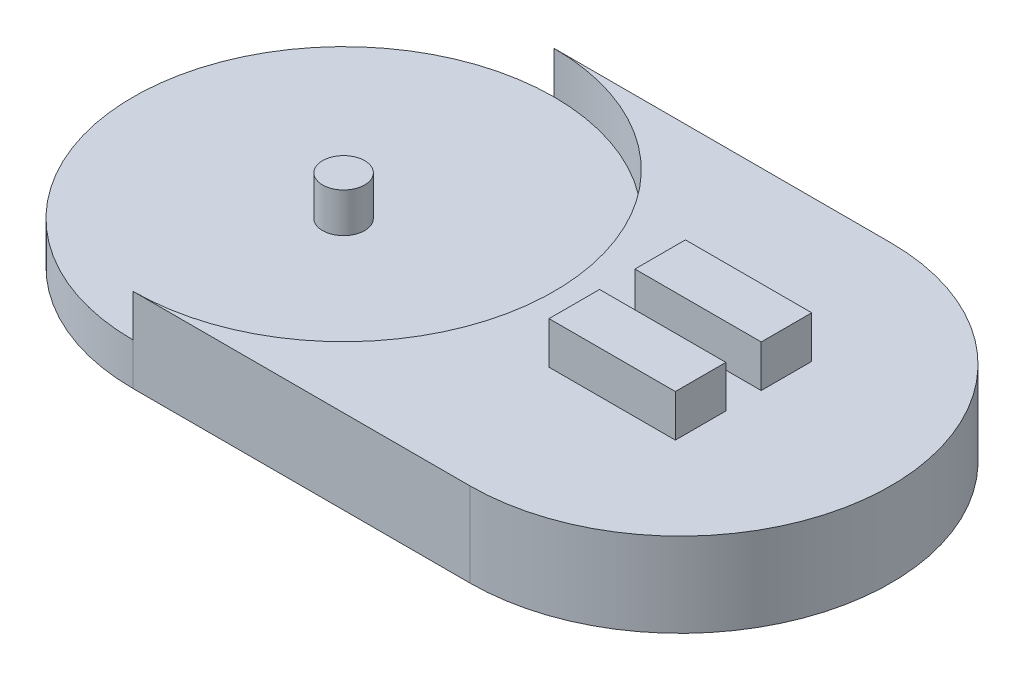
ISO-10303-21;
HEADER;
FILE_DESCRIPTION(('STEP AP214'),'2;1');
FILE_NAME('part.step','',(''),(''),'','','');
FILE_SCHEMA(('AUTOMOTIVE_DESIGN { 1 0 10303 214 1 1 1 1 }'));
ENDSEC;
DATA;
#1=APPLICATION_CONTEXT('core data for automotive mechanical design processes');
#2=APPLICATION_PROTOCOL_DEFINITION('international standard','automotive_design',2000,#1);
#3=PRODUCT_CONTEXT('',#1,'mechanical');
#4=PRODUCT('Part','Part','',(#3));
#5=PRODUCT_RELATED_PRODUCT_CATEGORY('part','',(#4));
#6=PRODUCT_DEFINITION_FORMATION('','',#4);
#7=PRODUCT_DEFINITION_CONTEXT('part definition',#1,'design');
#8=PRODUCT_DEFINITION('design','',#6,#7);
#9=PRODUCT_DEFINITION_SHAPE('','',#8);
#10=(LENGTH_UNIT() NAMED_UNIT(*) SI_UNIT(.MILLI.,.METRE.));
#11=(NAMED_UNIT(*) PLANE_ANGLE_UNIT() SI_UNIT($,.RADIAN.));
#12=(NAMED_UNIT(*) SI_UNIT($,.STERADIAN.) SOLID_ANGLE_UNIT());
#13=UNCERTAINTY_MEASURE_WITH_UNIT(LENGTH_MEASURE(1.E-05),#10,'distance_accuracy_value','');
#14=(GEOMETRIC_REPRESENTATION_CONTEXT(3) GLOBAL_UNCERTAINTY_ASSIGNED_CONTEXT((#13)) GLOBAL_UNIT_ASSIGNED_CONTEXT((#10,
#11,#12)) REPRESENTATION_CONTEXT('',''));
#15=CARTESIAN_POINT('',(0.,0.,0.));
#16=DIRECTION('',(0.,0.,1.));
#17=DIRECTION('',(1.,0.,0.));
#18=AXIS2_PLACEMENT_3D('',#15,#16,#17);
#19=CARTESIAN_POINT('',(0.,10.,0.));
#20=DIRECTION('',(0.,1.,0.));
#21=DIRECTION('',(0.,0.,1.));
#22=AXIS2_PLACEMENT_3D('',#19,#20,#21);
#23=PLANE('',#22);
#24=CARTESIAN_POINT('',(0.,10.,0.));
#25=DIRECTION('',(0.,1.,0.));
#26=DIRECTION('',(0.,0.,1.));
#27=AXIS2_PLACEMENT_3D('',#24,#25,#26);
#28=CIRCLE('',#27,25.);
#29=CARTESIAN_POINT('',(0.,10.,25.));
#30=VERTEX_POINT('',#29);
#31=CARTESIAN_POINT('',(0.,10.,-25.));
#32=VERTEX_POINT('',#31);
#33=EDGE_CURVE('E213',#30,#32,#28,.T.);
#34=ORIENTED_EDGE('',*,*,#33,.F.);
#35=DIRECTION('',(1.,0.,0.));
#36=VECTOR('',#35,1.);
#37=CARTESIAN_POINT('',(0.,10.,25.));
#38=LINE('',#37,#36);
#39=CARTESIAN_POINT('',(40.,10.,25.));
#40=VERTEX_POINT('',#39);
#41=EDGE_CURVE('E225',#30,#40,#38,.T.);
#42=ORIENTED_EDGE('',*,*,#41,.T.);
#43=CARTESIAN_POINT('',(40.,10.,0.));
#44=DIRECTION('',(0.,1.,0.));
#45=DIRECTION('',(0.,0.,1.));
#46=AXIS2_PLACEMENT_3D('',#43,#44,#45);
#47=CIRCLE('',#46,25.);
#48=CARTESIAN_POINT('',(40.,10.,-25.));
#49=VERTEX_POINT('',#48);
#50=EDGE_CURVE('E228',#40,#49,#47,.T.);
#51=ORIENTED_EDGE('',*,*,#50,.T.);
#52=DIRECTION('',(-1.,0.,0.));
#53=VECTOR('',#52,1.);
#54=CARTESIAN_POINT('',(0.,10.,-25.));
#55=LINE('',#54,#53);
#56=EDGE_CURVE('E232',#49,#32,#55,.T.);
#57=ORIENTED_EDGE('',*,*,#56,.T.);
#58=EDGE_LOOP('',(#34,#42,#51,#57));
#59=FACE_BOUND('',#58,.T.);
#60=DIRECTION('',(1.,0.,0.));
#61=VECTOR('',#60,1.);
#62=CARTESIAN_POINT('',(32.5,10.,-2.1));
#63=LINE('',#62,#61);
#64=CARTESIAN_POINT('',(32.5,10.,-2.1));
#65=VERTEX_POINT('',#64);
#66=CARTESIAN_POINT('',(47.5,10.,-2.10000000000001));
#67=VERTEX_POINT('',#66);
#68=EDGE_CURVE('E169',#65,#67,#63,.T.);
#69=ORIENTED_EDGE('',*,*,#68,.F.);
#70=DIRECTION('',(0.,0.,1.));
#71=VECTOR('',#70,1.);
#72=CARTESIAN_POINT('',(32.5,10.,-8.1));
#73=LINE('',#72,#71);
#74=CARTESIAN_POINT('',(32.5,10.,-8.1));
#75=VERTEX_POINT('',#74);
#76=EDGE_CURVE('E164',#75,#65,#73,.T.);
#77=ORIENTED_EDGE('',*,*,#76,.F.);
#78=DIRECTION('',(-1.,0.,0.));
#79=VECTOR('',#78,1.);
#80=CARTESIAN_POINT('',(32.5,10.,-8.1));
#81=LINE('',#80,#79);
#82=CARTESIAN_POINT('',(47.5,10.,-8.10000000000001));
#83=VERTEX_POINT('',#82);
#84=EDGE_CURVE('E179',#83,#75,#81,.T.);
#85=ORIENTED_EDGE('',*,*,#84,.F.);
#86=DIRECTION('',(0.,0.,-1.));
#87=VECTOR('',#86,1.);
#88=CARTESIAN_POINT('',(47.5,10.,-8.10000000000001));
#89=LINE('',#88,#87);
#90=EDGE_CURVE('E191',#67,#83,#89,.T.);
#91=ORIENTED_EDGE('',*,*,#90,.F.);
#92=EDGE_LOOP('',(#69,#77,#85,#91));
#93=FACE_BOUND('',#92,.T.);
#94=DIRECTION('',(1.,0.,0.));
#95=VECTOR('',#94,1.);
#96=CARTESIAN_POINT('',(32.5,10.,8.1));
#97=LINE('',#96,#95);
#98=CARTESIAN_POINT('',(32.5,10.,8.1));
#99=VERTEX_POINT('',#98);
#100=CARTESIAN_POINT('',(47.5,10.,8.1));
#101=VERTEX_POINT('',#100);
#102=EDGE_CURVE('E465',#99,#101,#97,.T.);
#103=ORIENTED_EDGE('',*,*,#102,.F.);
#104=DIRECTION('',(0.,0.,1.));
#105=VECTOR('',#104,1.);
#106=CARTESIAN_POINT('',(32.5,10.,2.1));
#107=LINE('',#106,#105);
#108=CARTESIAN_POINT('',(32.5,10.,2.1));
#109=VERTEX_POINT('',#108);
#110=EDGE_CURVE('E161',#109,#99,#107,.T.);
#111=ORIENTED_EDGE('',*,*,#110,.F.);
#112=DIRECTION('',(-1.,0.,0.));
#113=VECTOR('',#112,1.);
#114=CARTESIAN_POINT('',(32.5,10.,2.1));
#115=LINE('',#114,#113);
#116=CARTESIAN_POINT('',(47.5,10.,2.1));
#117=VERTEX_POINT('',#116);
#118=EDGE_CURVE('E157',#117,#109,#115,.T.);
#119=ORIENTED_EDGE('',*,*,#118,.F.);
#120=DIRECTION('',(0.,0.,-1.));
#121=VECTOR('',#120,1.);
#122=CARTESIAN_POINT('',(47.5,10.,2.1));
#123=LINE('',#122,#121);
#124=EDGE_CURVE('E461',#101,#117,#123,.T.);
#125=ORIENTED_EDGE('',*,*,#124,.F.);
#126=EDGE_LOOP('',(#103,#111,#119,#125));
#127=FACE_BOUND('',#126,.T.);
#128=ADVANCED_FACE('F39',(#59,#93,#127),#23,.T.);
#129=CARTESIAN_POINT('',(0.,10.,0.));
#130=DIRECTION('',(0.,-1.,0.));
#131=DIRECTION('',(0.,0.,-1.));
#132=AXIS2_PLACEMENT_3D('',#129,#130,#131);
#133=CYLINDRICAL_SURFACE('',#132,25.);
#134=CARTESIAN_POINT('',(0.,5.,0.));
#135=DIRECTION('',(0.,1.,0.));
#136=DIRECTION('',(0.,0.,1.));
#137=AXIS2_PLACEMENT_3D('',#134,#135,#136);
#138=CIRCLE('',#137,25.);
#139=CARTESIAN_POINT('',(0.,5.,-25.));
#140=VERTEX_POINT('',#139);
#141=CARTESIAN_POINT('',(0.,5.,25.));
#142=VERTEX_POINT('',#141);
#143=EDGE_CURVE('E222',#140,#142,#138,.T.);
#144=ORIENTED_EDGE('',*,*,#143,.F.);
#145=DIRECTION('',(0.,-1.,0.));
#146=VECTOR('',#145,1.);
#147=CARTESIAN_POINT('',(0.,10.,-25.));
#148=LINE('',#147,#146);
#149=CARTESIAN_POINT('',(0.,0.,-25.));
#150=VERTEX_POINT('',#149);
#151=EDGE_CURVE('E236',#140,#150,#148,.T.);
#152=ORIENTED_EDGE('',*,*,#151,.T.);
#153=CARTESIAN_POINT('',(0.,0.,0.));
#154=DIRECTION('',(0.,1.,0.));
#155=DIRECTION('',(0.,0.,1.));
#156=AXIS2_PLACEMENT_3D('',#153,#154,#155);
#157=CIRCLE('',#156,25.);
#158=CARTESIAN_POINT('',(0.,0.,25.));
#159=VERTEX_POINT('',#158);
#160=EDGE_CURVE('E221',#150,#159,#157,.T.);
#161=ORIENTED_EDGE('',*,*,#160,.T.);
#162=DIRECTION('',(0.,-1.,0.));
#163=VECTOR('',#162,1.);
#164=CARTESIAN_POINT('',(0.,10.,25.));
#165=LINE('',#164,#163);
#166=EDGE_CURVE('E48',#142,#159,#165,.T.);
#167=ORIENTED_EDGE('',*,*,#166,.F.);
#168=EDGE_LOOP('',(#144,#152,#161,#167));
#169=FACE_BOUND('',#168,.T.);
#170=ADVANCED_FACE('F41',(#169),#133,.T.);
#171=CARTESIAN_POINT('',(0.,10.,25.));
#172=DIRECTION('',(0.,0.,-1.));
#173=DIRECTION('',(-1.,0.,0.));
#174=AXIS2_PLACEMENT_3D('',#171,#172,#173);
#175=PLANE('',#174);
#176=DIRECTION('',(1.,0.,0.));
#177=VECTOR('',#176,1.);
#178=CARTESIAN_POINT('',(0.,0.,25.));
#179=LINE('',#178,#177);
#180=CARTESIAN_POINT('',(40.,0.,25.));
#181=VERTEX_POINT('',#180);
#182=EDGE_CURVE('E240',#159,#181,#179,.T.);
#183=ORIENTED_EDGE('',*,*,#182,.T.);
#184=DIRECTION('',(0.,-1.,0.));
#185=VECTOR('',#184,1.);
#186=CARTESIAN_POINT('',(40.,10.,25.));
#187=LINE('',#186,#185);
#188=EDGE_CURVE('E255',#40,#181,#187,.T.);
#189=ORIENTED_EDGE('',*,*,#188,.F.);
#190=ORIENTED_EDGE('',*,*,#41,.F.);
#191=EDGE_CURVE('E11',#30,#142,#165,.T.);
#192=ORIENTED_EDGE('',*,*,#191,.T.);
#193=ORIENTED_EDGE('',*,*,#166,.T.);
#194=EDGE_LOOP('',(#183,#189,#190,#192,#193));
#195=FACE_BOUND('',#194,.T.);
#196=ADVANCED_FACE('F266',(#195),#175,.F.);
#197=CARTESIAN_POINT('',(40.,10.,0.));
#198=DIRECTION('',(0.,-1.,0.));
#199=DIRECTION('',(0.,0.,-1.));
#200=AXIS2_PLACEMENT_3D('',#197,#198,#199);
#201=CYLINDRICAL_SURFACE('',#200,25.);
#202=CARTESIAN_POINT('',(40.,0.,0.));
#203=DIRECTION('',(0.,1.,0.));
#204=DIRECTION('',(0.,0.,1.));
#205=AXIS2_PLACEMENT_3D('',#202,#203,#204);
#206=CIRCLE('',#205,25.);
#207=CARTESIAN_POINT('',(40.,0.,-25.));
#208=VERTEX_POINT('',#207);
#209=EDGE_CURVE('E243',#181,#208,#206,.T.);
#210=ORIENTED_EDGE('',*,*,#209,.T.);
#211=DIRECTION('',(0.,-1.,0.));
#212=VECTOR('',#211,1.);
#213=CARTESIAN_POINT('',(40.,10.,-25.));
#214=LINE('',#213,#212);
#215=EDGE_CURVE('E252',#49,#208,#214,.T.);
#216=ORIENTED_EDGE('',*,*,#215,.F.);
#217=ORIENTED_EDGE('',*,*,#50,.F.);
#218=ORIENTED_EDGE('',*,*,#188,.T.);
#219=EDGE_LOOP('',(#210,#216,#217,#218));
#220=FACE_BOUND('',#219,.T.);
#221=ADVANCED_FACE('F281',(#220),#201,.T.);
#222=CARTESIAN_POINT('',(0.,10.,-25.));
#223=DIRECTION('',(0.,0.,1.));
#224=DIRECTION('',(1.,0.,0.));
#225=AXIS2_PLACEMENT_3D('',#222,#223,#224);
#226=PLANE('',#225);
#227=DIRECTION('',(-1.,0.,0.));
#228=VECTOR('',#227,1.);
#229=CARTESIAN_POINT('',(0.,0.,-25.));
#230=LINE('',#229,#228);
#231=EDGE_CURVE('E229',#208,#150,#230,.T.);
#232=ORIENTED_EDGE('',*,*,#231,.T.);
#233=ORIENTED_EDGE('',*,*,#151,.F.);
#234=EDGE_CURVE('E249',#32,#140,#148,.T.);
#235=ORIENTED_EDGE('',*,*,#234,.F.);
#236=ORIENTED_EDGE('',*,*,#56,.F.);
#237=ORIENTED_EDGE('',*,*,#215,.T.);
#238=EDGE_LOOP('',(#232,#233,#235,#236,#237));
#239=FACE_BOUND('',#238,.T.);
#240=ADVANCED_FACE('F278',(#239),#226,.F.);
#241=CARTESIAN_POINT('',(0.,0.,0.));
#242=DIRECTION('',(0.,1.,0.));
#243=DIRECTION('',(0.,0.,1.));
#244=AXIS2_PLACEMENT_3D('',#241,#242,#243);
#245=PLANE('',#244);
#246=ORIENTED_EDGE('',*,*,#160,.F.);
#247=ORIENTED_EDGE('',*,*,#231,.F.);
#248=ORIENTED_EDGE('',*,*,#209,.F.);
#249=ORIENTED_EDGE('',*,*,#182,.F.);
#250=EDGE_LOOP('',(#246,#247,#248,#249));
#251=FACE_BOUND('',#250,.T.);
#252=ADVANCED_FACE('F272',(#251),#245,.F.);
#253=CARTESIAN_POINT('',(0.,5.,0.));
#254=DIRECTION('',(0.,1.,0.));
#255=DIRECTION('',(0.,0.,1.));
#256=AXIS2_PLACEMENT_3D('',#253,#254,#255);
#257=CYLINDRICAL_SURFACE('',#256,25.);
#258=ORIENTED_EDGE('',*,*,#191,.F.);
#259=ORIENTED_EDGE('',*,*,#33,.T.);
#260=ORIENTED_EDGE('',*,*,#234,.T.);
#261=EDGE_CURVE('E217',#142,#140,#138,.T.);
#262=ORIENTED_EDGE('',*,*,#261,.F.);
#263=EDGE_LOOP('',(#258,#259,#260,#262));
#264=FACE_BOUND('',#263,.T.);
#265=ADVANCED_FACE('F286',(#264),#257,.F.);
#266=CARTESIAN_POINT('',(0.,5.,0.));
#267=DIRECTION('',(0.,1.,0.));
#268=DIRECTION('',(0.,0.,1.));
#269=AXIS2_PLACEMENT_3D('',#266,#267,#268);
#270=PLANE('',#269);
#271=CARTESIAN_POINT('',(0.,5.,0.));
#272=DIRECTION('',(0.,1.,0.));
#273=DIRECTION('',(0.,0.,1.));
#274=AXIS2_PLACEMENT_3D('',#271,#272,#273);
#275=CIRCLE('',#274,2.5);
#276=CARTESIAN_POINT('',(0.,5.,2.5));
#277=VERTEX_POINT('',#276);
#278=EDGE_CURVE('E208',#277,#277,#275,.T.);
#279=ORIENTED_EDGE('',*,*,#278,.F.);
#280=EDGE_LOOP('',(#279));
#281=FACE_BOUND('',#280,.T.);
#282=ORIENTED_EDGE('',*,*,#261,.T.);
#283=ORIENTED_EDGE('',*,*,#143,.T.);
#284=EDGE_LOOP('',(#282,#283));
#285=FACE_BOUND('',#284,.T.);
#286=ADVANCED_FACE('F289',(#281,#285),#270,.T.);
#287=CARTESIAN_POINT('',(0.,9.7,0.));
#288=DIRECTION('',(0.,-1.,0.));
#289=DIRECTION('',(0.,0.,-1.));
#290=AXIS2_PLACEMENT_3D('',#287,#288,#289);
#291=CYLINDRICAL_SURFACE('',#290,2.5);
#292=CARTESIAN_POINT('',(0.,9.7,0.));
#293=DIRECTION('',(0.,1.,0.));
#294=DIRECTION('',(0.,0.,1.));
#295=AXIS2_PLACEMENT_3D('',#292,#293,#294);
#296=CIRCLE('',#295,2.5);
#297=CARTESIAN_POINT('',(0.,9.7,2.5));
#298=VERTEX_POINT('',#297);
#299=EDGE_CURVE('E209',#298,#298,#296,.T.);
#300=ORIENTED_EDGE('',*,*,#299,.F.);
#301=EDGE_LOOP('',(#300));
#302=FACE_BOUND('',#301,.T.);
#303=ORIENTED_EDGE('',*,*,#278,.T.);
#304=EDGE_LOOP('',(#303));
#305=FACE_BOUND('',#304,.T.);
#306=ADVANCED_FACE('F292',(#302,#305),#291,.T.);
#307=CARTESIAN_POINT('',(0.,9.7,0.));
#308=DIRECTION('',(0.,1.,0.));
#309=DIRECTION('',(0.,0.,1.));
#310=AXIS2_PLACEMENT_3D('',#307,#308,#309);
#311=PLANE('',#310);
#312=ORIENTED_EDGE('',*,*,#299,.T.);
#313=EDGE_LOOP('',(#312));
#314=FACE_BOUND('',#313,.T.);
#315=ADVANCED_FACE('F299',(#314),#311,.T.);
#316=CARTESIAN_POINT('',(32.5,15.,-8.1));
#317=DIRECTION('',(1.,0.,0.));
#318=DIRECTION('',(0.,0.,-1.));
#319=AXIS2_PLACEMENT_3D('',#316,#317,#318);
#320=PLANE('',#319);
#321=ORIENTED_EDGE('',*,*,#76,.T.);
#322=DIRECTION('',(0.,-1.,0.));
#323=VECTOR('',#322,1.);
#324=CARTESIAN_POINT('',(32.5,15.,-2.1));
#325=LINE('',#324,#323);
#326=CARTESIAN_POINT('',(32.5,15.,-2.1));
#327=VERTEX_POINT('',#326);
#328=EDGE_CURVE('E205',#327,#65,#325,.T.);
#329=ORIENTED_EDGE('',*,*,#328,.F.);
#330=DIRECTION('',(0.,0.,1.));
#331=VECTOR('',#330,1.);
#332=CARTESIAN_POINT('',(32.5,15.,-8.1));
#333=LINE('',#332,#331);
#334=CARTESIAN_POINT('',(32.5,15.,-8.1));
#335=VERTEX_POINT('',#334);
#336=EDGE_CURVE('E174',#335,#327,#333,.T.);
#337=ORIENTED_EDGE('',*,*,#336,.F.);
#338=DIRECTION('',(0.,-1.,0.));
#339=VECTOR('',#338,1.);
#340=CARTESIAN_POINT('',(32.5,15.,-8.1));
#341=LINE('',#340,#339);
#342=EDGE_CURVE('E187',#335,#75,#341,.T.);
#343=ORIENTED_EDGE('',*,*,#342,.T.);
#344=EDGE_LOOP('',(#321,#329,#337,#343));
#345=FACE_BOUND('',#344,.T.);
#346=ADVANCED_FACE('F355',(#345),#320,.F.);
#347=CARTESIAN_POINT('',(32.5,15.,-2.1));
#348=DIRECTION('',(0.,0.,-1.));
#349=DIRECTION('',(-1.,0.,0.));
#350=AXIS2_PLACEMENT_3D('',#347,#348,#349);
#351=PLANE('',#350);
#352=ORIENTED_EDGE('',*,*,#68,.T.);
#353=DIRECTION('',(0.,-1.,0.));
#354=VECTOR('',#353,1.);
#355=CARTESIAN_POINT('',(47.5,15.,-2.10000000000001));
#356=LINE('',#355,#354);
#357=CARTESIAN_POINT('',(47.5,15.,-2.10000000000001));
#358=VERTEX_POINT('',#357);
#359=EDGE_CURVE('E201',#358,#67,#356,.T.);
#360=ORIENTED_EDGE('',*,*,#359,.F.);
#361=DIRECTION('',(1.,0.,0.));
#362=VECTOR('',#361,1.);
#363=CARTESIAN_POINT('',(32.5,15.,-2.1));
#364=LINE('',#363,#362);
#365=EDGE_CURVE('E178',#327,#358,#364,.T.);
#366=ORIENTED_EDGE('',*,*,#365,.F.);
#367=ORIENTED_EDGE('',*,*,#328,.T.);
#368=EDGE_LOOP('',(#352,#360,#366,#367));
#369=FACE_BOUND('',#368,.T.);
#370=ADVANCED_FACE('F370',(#369),#351,.F.);
#371=CARTESIAN_POINT('',(47.5,15.,-8.10000000000001));
#372=DIRECTION('',(-1.,0.,0.));
#373=DIRECTION('',(0.,0.,1.));
#374=AXIS2_PLACEMENT_3D('',#371,#372,#373);
#375=PLANE('',#374);
#376=ORIENTED_EDGE('',*,*,#90,.T.);
#377=DIRECTION('',(0.,-1.,0.));
#378=VECTOR('',#377,1.);
#379=CARTESIAN_POINT('',(47.5,15.,-8.10000000000001));
#380=LINE('',#379,#378);
#381=CARTESIAN_POINT('',(47.5,15.,-8.10000000000001));
#382=VERTEX_POINT('',#381);
#383=EDGE_CURVE('E63',#382,#83,#380,.T.);
#384=ORIENTED_EDGE('',*,*,#383,.F.);
#385=DIRECTION('',(0.,0.,-1.));
#386=VECTOR('',#385,1.);
#387=CARTESIAN_POINT('',(47.5,15.,-8.10000000000001));
#388=LINE('',#387,#386);
#389=EDGE_CURVE('E182',#358,#382,#388,.T.);
#390=ORIENTED_EDGE('',*,*,#389,.F.);
#391=ORIENTED_EDGE('',*,*,#359,.T.);
#392=EDGE_LOOP('',(#376,#384,#390,#391));
#393=FACE_BOUND('',#392,.T.);
#394=ADVANCED_FACE('F380',(#393),#375,.F.);
#395=CARTESIAN_POINT('',(32.5,15.,-8.1));
#396=DIRECTION('',(0.,0.,1.));
#397=DIRECTION('',(1.,0.,0.));
#398=AXIS2_PLACEMENT_3D('',#395,#396,#397);
#399=PLANE('',#398);
#400=ORIENTED_EDGE('',*,*,#84,.T.);
#401=ORIENTED_EDGE('',*,*,#342,.F.);
#402=DIRECTION('',(-1.,0.,0.));
#403=VECTOR('',#402,1.);
#404=CARTESIAN_POINT('',(32.5,15.,-8.1));
#405=LINE('',#404,#403);
#406=EDGE_CURVE('E185',#382,#335,#405,.T.);
#407=ORIENTED_EDGE('',*,*,#406,.F.);
#408=ORIENTED_EDGE('',*,*,#383,.T.);
#409=EDGE_LOOP('',(#400,#401,#407,#408));
#410=FACE_BOUND('',#409,.T.);
#411=ADVANCED_FACE('F390',(#410),#399,.F.);
#412=CARTESIAN_POINT('',(0.,15.,0.));
#413=DIRECTION('',(0.,1.,0.));
#414=DIRECTION('',(0.,0.,1.));
#415=AXIS2_PLACEMENT_3D('',#412,#413,#414);
#416=PLANE('',#415);
#417=ORIENTED_EDGE('',*,*,#336,.T.);
#418=ORIENTED_EDGE('',*,*,#365,.T.);
#419=ORIENTED_EDGE('',*,*,#389,.T.);
#420=ORIENTED_EDGE('',*,*,#406,.T.);
#421=EDGE_LOOP('',(#417,#418,#419,#420));
#422=FACE_BOUND('',#421,.T.);
#423=ADVANCED_FACE('F400',(#422),#416,.T.);
#424=CARTESIAN_POINT('',(32.5,15.,2.1));
#425=DIRECTION('',(1.,0.,0.));
#426=DIRECTION('',(0.,0.,-1.));
#427=AXIS2_PLACEMENT_3D('',#424,#425,#426);
#428=PLANE('',#427);
#429=ORIENTED_EDGE('',*,*,#110,.T.);
#430=DIRECTION('',(0.,-1.,0.));
#431=VECTOR('',#430,1.);
#432=CARTESIAN_POINT('',(32.5,15.,8.1));
#433=LINE('',#432,#431);
#434=CARTESIAN_POINT('',(32.5,15.,8.1));
#435=VERTEX_POINT('',#434);
#436=EDGE_CURVE('E140',#435,#99,#433,.T.);
#437=ORIENTED_EDGE('',*,*,#436,.F.);
#438=DIRECTION('',(0.,0.,1.));
#439=VECTOR('',#438,1.);
#440=CARTESIAN_POINT('',(32.5,15.,2.1));
#441=LINE('',#440,#439);
#442=CARTESIAN_POINT('',(32.5,15.,2.1));
#443=VERTEX_POINT('',#442);
#444=EDGE_CURVE('E148',#443,#435,#441,.T.);
#445=ORIENTED_EDGE('',*,*,#444,.F.);
#446=DIRECTION('',(0.,-1.,0.));
#447=VECTOR('',#446,1.);
#448=CARTESIAN_POINT('',(32.5,15.,2.1));
#449=LINE('',#448,#447);
#450=EDGE_CURVE('E457',#443,#109,#449,.T.);
#451=ORIENTED_EDGE('',*,*,#450,.T.);
#452=EDGE_LOOP('',(#429,#437,#445,#451));
#453=FACE_BOUND('',#452,.T.);
#454=ADVANCED_FACE('F159',(#453),#428,.F.);
#455=CARTESIAN_POINT('',(32.5,15.,8.1));
#456=DIRECTION('',(0.,0.,-1.));
#457=DIRECTION('',(-1.,0.,0.));
#458=AXIS2_PLACEMENT_3D('',#455,#456,#457);
#459=PLANE('',#458);
#460=ORIENTED_EDGE('',*,*,#102,.T.);
#461=DIRECTION('',(0.,-1.,0.));
#462=VECTOR('',#461,1.);
#463=CARTESIAN_POINT('',(47.5,15.,8.1));
#464=LINE('',#463,#462);
#465=CARTESIAN_POINT('',(47.5,15.,8.1));
#466=VERTEX_POINT('',#465);
#467=EDGE_CURVE('E143',#466,#101,#464,.T.);
#468=ORIENTED_EDGE('',*,*,#467,.F.);
#469=DIRECTION('',(1.,0.,0.));
#470=VECTOR('',#469,1.);
#471=CARTESIAN_POINT('',(32.5,15.,8.1));
#472=LINE('',#471,#470);
#473=EDGE_CURVE('E136',#435,#466,#472,.T.);
#474=ORIENTED_EDGE('',*,*,#473,.F.);
#475=ORIENTED_EDGE('',*,*,#436,.T.);
#476=EDGE_LOOP('',(#460,#468,#474,#475));
#477=FACE_BOUND('',#476,.T.);
#478=ADVANCED_FACE('F138',(#477),#459,.F.);
#479=CARTESIAN_POINT('',(47.5,15.,2.1));
#480=DIRECTION('',(-1.,0.,0.));
#481=DIRECTION('',(0.,0.,1.));
#482=AXIS2_PLACEMENT_3D('',#479,#480,#481);
#483=PLANE('',#482);
#484=ORIENTED_EDGE('',*,*,#124,.T.);
#485=DIRECTION('',(0.,-1.,0.));
#486=VECTOR('',#485,1.);
#487=CARTESIAN_POINT('',(47.5,15.,2.1));
#488=LINE('',#487,#486);
#489=CARTESIAN_POINT('',(47.5,15.,2.1));
#490=VERTEX_POINT('',#489);
#491=EDGE_CURVE('E55',#490,#117,#488,.T.);
#492=ORIENTED_EDGE('',*,*,#491,.F.);
#493=DIRECTION('',(0.,0.,-1.));
#494=VECTOR('',#493,1.);
#495=CARTESIAN_POINT('',(47.5,15.,2.1));
#496=LINE('',#495,#494);
#497=EDGE_CURVE('E147',#466,#490,#496,.T.);
#498=ORIENTED_EDGE('',*,*,#497,.F.);
#499=ORIENTED_EDGE('',*,*,#467,.T.);
#500=EDGE_LOOP('',(#484,#492,#498,#499));
#501=FACE_BOUND('',#500,.T.);
#502=ADVANCED_FACE('F426',(#501),#483,.F.);
#503=CARTESIAN_POINT('',(32.5,15.,2.1));
#504=DIRECTION('',(0.,0.,1.));
#505=DIRECTION('',(1.,0.,0.));
#506=AXIS2_PLACEMENT_3D('',#503,#504,#505);
#507=PLANE('',#506);
#508=ORIENTED_EDGE('',*,*,#118,.T.);
#509=ORIENTED_EDGE('',*,*,#450,.F.);
#510=DIRECTION('',(-1.,0.,0.));
#511=VECTOR('',#510,1.);
#512=CARTESIAN_POINT('',(32.5,15.,2.1));
#513=LINE('',#512,#511);
#514=EDGE_CURVE('E152',#490,#443,#513,.T.);
#515=ORIENTED_EDGE('',*,*,#514,.F.);
#516=ORIENTED_EDGE('',*,*,#491,.T.);
#517=EDGE_LOOP('',(#508,#509,#515,#516));
#518=FACE_BOUND('',#517,.T.);
#519=ADVANCED_FACE('F435',(#518),#507,.F.);
#520=CARTESIAN_POINT('',(0.,15.,0.));
#521=DIRECTION('',(0.,1.,0.));
#522=DIRECTION('',(0.,0.,1.));
#523=AXIS2_PLACEMENT_3D('',#520,#521,#522);
#524=PLANE('',#523);
#525=ORIENTED_EDGE('',*,*,#444,.T.);
#526=ORIENTED_EDGE('',*,*,#473,.T.);
#527=ORIENTED_EDGE('',*,*,#497,.T.);
#528=ORIENTED_EDGE('',*,*,#514,.T.);
#529=EDGE_LOOP('',(#525,#526,#527,#528));
#530=FACE_BOUND('',#529,.T.);
#531=ADVANCED_FACE('F151',(#530),#524,.T.);
#532=CLOSED_SHELL('',(#128,#170,#196,#221,#240,#252,#265,#286,#306,#315,#346,#370,#394,#411,
#423,#454,#478,#502,#519,#531));
#533=MANIFOLD_SOLID_BREP('B2',#532);
#534=ADVANCED_BREP_SHAPE_REPRESENTATION('',(#18,#533),#14);
#535=SHAPE_DEFINITION_REPRESENTATION(#9,#534);
ENDSEC;
END-ISO-10303-21;
